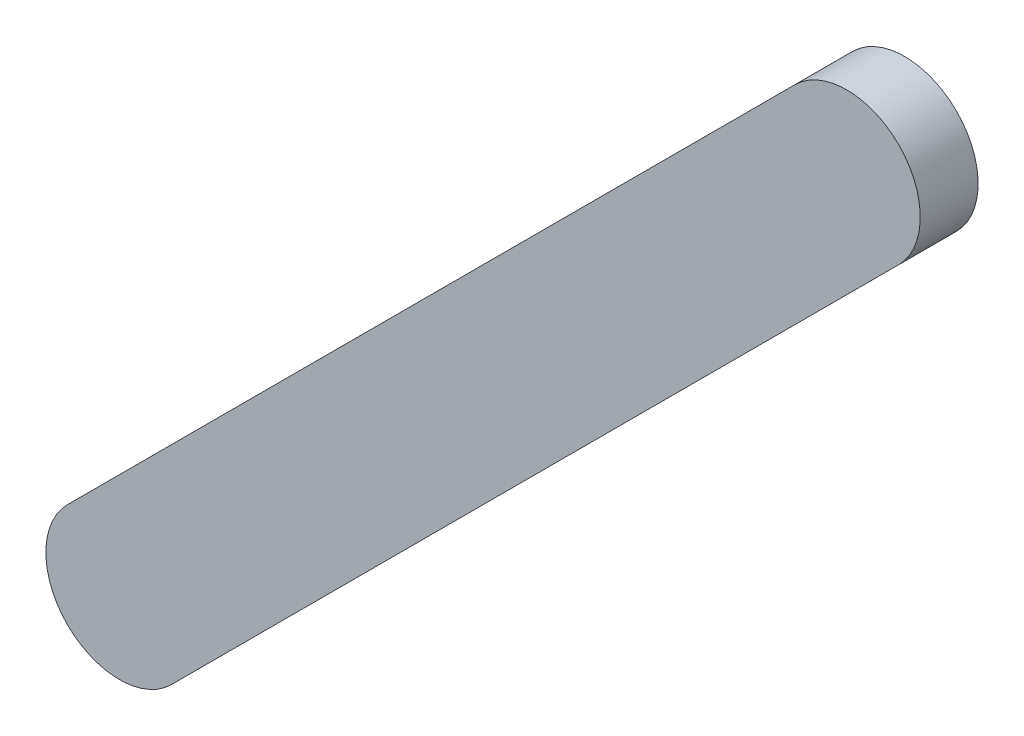
ISO-10303-21;
HEADER;
FILE_DESCRIPTION(('STEP AP214'),'2;1');
FILE_NAME('part.step','',(''),(''),'','','');
FILE_SCHEMA(('AUTOMOTIVE_DESIGN { 1 0 10303 214 1 1 1 1 }'));
ENDSEC;
DATA;
#1=APPLICATION_CONTEXT('core data for automotive mechanical design processes');
#2=APPLICATION_PROTOCOL_DEFINITION('international standard','automotive_design',2000,#1);
#3=PRODUCT_CONTEXT('',#1,'mechanical');
#4=PRODUCT('Part','Part','',(#3));
#5=PRODUCT_RELATED_PRODUCT_CATEGORY('part','',(#4));
#6=PRODUCT_DEFINITION_FORMATION('','',#4);
#7=PRODUCT_DEFINITION_CONTEXT('part definition',#1,'design');
#8=PRODUCT_DEFINITION('design','',#6,#7);
#9=PRODUCT_DEFINITION_SHAPE('','',#8);
#10=(LENGTH_UNIT() NAMED_UNIT(*) SI_UNIT(.MILLI.,.METRE.));
#11=(NAMED_UNIT(*) PLANE_ANGLE_UNIT() SI_UNIT($,.RADIAN.));
#12=(NAMED_UNIT(*) SI_UNIT($,.STERADIAN.) SOLID_ANGLE_UNIT());
#13=UNCERTAINTY_MEASURE_WITH_UNIT(LENGTH_MEASURE(1.E-05),#10,'distance_accuracy_value','');
#14=(GEOMETRIC_REPRESENTATION_CONTEXT(3) GLOBAL_UNCERTAINTY_ASSIGNED_CONTEXT((#13)) GLOBAL_UNIT_ASSIGNED_CONTEXT((#10,
#11,#12)) REPRESENTATION_CONTEXT('',''));
#15=CARTESIAN_POINT('',(0.,0.,0.));
#16=DIRECTION('',(0.,0.,1.));
#17=DIRECTION('',(1.,0.,0.));
#18=AXIS2_PLACEMENT_3D('',#15,#16,#17);
#19=CARTESIAN_POINT('',(113.2096034,68.90839406,0.));
#20=DIRECTION('',(-0.70710678118655,0.707106781186546,0.));
#21=DIRECTION('',(0.707106781186546,0.70710678118655,0.));
#22=AXIS2_PLACEMENT_3D('',#19,#20,#21);
#23=PLANE('',#22);
#24=DIRECTION('',(0.707106781186545,0.70710678118655,0.));
#25=VECTOR('',#24,1.);
#26=CARTESIAN_POINT('',(113.2096034,68.90839406,0.1999996));
#27=LINE('',#26,#25);
#28=CARTESIAN_POINT('',(113.2096034,68.90839406,0.1999996));
#29=VERTEX_POINT('',#28);
#30=CARTESIAN_POINT('',(115.72420594,71.4229966,0.1999996));
#31=VERTEX_POINT('',#30);
#32=EDGE_CURVE('E11',#29,#31,#27,.T.);
#33=ORIENTED_EDGE('',*,*,#32,.F.);
#34=DIRECTION('',(0.,0.,1.));
#35=VECTOR('',#34,1.);
#36=CARTESIAN_POINT('',(113.2096034,68.90839406,0.));
#37=LINE('',#36,#35);
#38=CARTESIAN_POINT('',(113.2096034,68.90839406,0.));
#39=VERTEX_POINT('',#38);
#40=EDGE_CURVE('E24',#39,#29,#37,.T.);
#41=ORIENTED_EDGE('',*,*,#40,.F.);
#42=DIRECTION('',(0.707106781186545,0.70710678118655,0.));
#43=VECTOR('',#42,1.);
#44=CARTESIAN_POINT('',(113.2096034,68.90839406,0.));
#45=LINE('',#44,#43);
#46=CARTESIAN_POINT('',(115.72420594,71.4229966,0.));
#47=VERTEX_POINT('',#46);
#48=EDGE_CURVE('E75',#39,#47,#45,.T.);
#49=ORIENTED_EDGE('',*,*,#48,.T.);
#50=DIRECTION('',(0.,0.,1.));
#51=VECTOR('',#50,1.);
#52=CARTESIAN_POINT('',(115.72420594,71.4229966,0.));
#53=LINE('',#52,#51);
#54=EDGE_CURVE('E37',#47,#31,#53,.T.);
#55=ORIENTED_EDGE('',*,*,#54,.T.);
#56=EDGE_LOOP('',(#33,#41,#49,#55));
#57=FACE_BOUND('',#56,.T.);
#58=ADVANCED_FACE('F17',(#57),#23,.F.);
#59=CARTESIAN_POINT('',(115.54460127,71.60260127,0.));
#60=DIRECTION('',(0.,0.,-1.));
#61=DIRECTION('',(0.707106781186548,-0.707106781186548,0.));
#62=AXIS2_PLACEMENT_3D('',#59,#60,#61);
#63=CYLINDRICAL_SURFACE('',#62,0.253999360179539);
#64=CARTESIAN_POINT('',(115.54460127,71.60260127,0.1999996));
#65=DIRECTION('',(0.,0.,1.));
#66=DIRECTION('',(0.707106781186548,-0.707106781186548,0.));
#67=AXIS2_PLACEMENT_3D('',#64,#65,#66);
#68=CIRCLE('',#67,0.253999360179539);
#69=CARTESIAN_POINT('',(115.3649966,71.78220594,0.1999996));
#70=VERTEX_POINT('',#69);
#71=EDGE_CURVE('E83',#31,#70,#68,.T.);
#72=ORIENTED_EDGE('',*,*,#71,.F.);
#73=ORIENTED_EDGE('',*,*,#54,.F.);
#74=CARTESIAN_POINT('',(115.54460127,71.60260127,0.));
#75=DIRECTION('',(0.,0.,1.));
#76=DIRECTION('',(0.707106781186548,-0.707106781186548,0.));
#77=AXIS2_PLACEMENT_3D('',#74,#75,#76);
#78=CIRCLE('',#77,0.253999360179539);
#79=CARTESIAN_POINT('',(115.3649966,71.78220594,0.));
#80=VERTEX_POINT('',#79);
#81=EDGE_CURVE('E81',#47,#80,#78,.T.);
#82=ORIENTED_EDGE('',*,*,#81,.T.);
#83=DIRECTION('',(0.,0.,1.));
#84=VECTOR('',#83,1.);
#85=CARTESIAN_POINT('',(115.3649966,71.78220594,0.));
#86=LINE('',#85,#84);
#87=EDGE_CURVE('E67',#80,#70,#86,.T.);
#88=ORIENTED_EDGE('',*,*,#87,.T.);
#89=EDGE_LOOP('',(#72,#73,#82,#88));
#90=FACE_BOUND('',#89,.T.);
#91=ADVANCED_FACE('F89',(#90),#63,.T.);
#92=CARTESIAN_POINT('',(115.3649966,71.78220594,0.));
#93=DIRECTION('',(0.707106781186546,-0.70710678118655,0.));
#94=DIRECTION('',(-0.70710678118655,-0.707106781186546,0.));
#95=AXIS2_PLACEMENT_3D('',#92,#93,#94);
#96=PLANE('',#95);
#97=DIRECTION('',(-0.70710678118655,-0.707106781186545,0.));
#98=VECTOR('',#97,1.);
#99=CARTESIAN_POINT('',(115.3649966,71.78220594,0.1999996));
#100=LINE('',#99,#98);
#101=CARTESIAN_POINT('',(112.85039406,69.2676034,0.1999996));
#102=VERTEX_POINT('',#101);
#103=EDGE_CURVE('E71',#70,#102,#100,.T.);
#104=ORIENTED_EDGE('',*,*,#103,.F.);
#105=ORIENTED_EDGE('',*,*,#87,.F.);
#106=DIRECTION('',(-0.70710678118655,-0.707106781186545,0.));
#107=VECTOR('',#106,1.);
#108=CARTESIAN_POINT('',(115.3649966,71.78220594,0.));
#109=LINE('',#108,#107);
#110=CARTESIAN_POINT('',(112.85039406,69.2676034,0.));
#111=VERTEX_POINT('',#110);
#112=EDGE_CURVE('E63',#80,#111,#109,.T.);
#113=ORIENTED_EDGE('',*,*,#112,.T.);
#114=DIRECTION('',(0.,0.,1.));
#115=VECTOR('',#114,1.);
#116=CARTESIAN_POINT('',(112.85039406,69.2676034,0.));
#117=LINE('',#116,#115);
#118=EDGE_CURVE('E53',#111,#102,#117,.T.);
#119=ORIENTED_EDGE('',*,*,#118,.T.);
#120=EDGE_LOOP('',(#104,#105,#113,#119));
#121=FACE_BOUND('',#120,.T.);
#122=ADVANCED_FACE('F66',(#121),#96,.F.);
#123=CARTESIAN_POINT('',(113.02999873,69.08799873,0.));
#124=DIRECTION('',(0.,0.,-1.));
#125=DIRECTION('',(-0.707106781186548,0.707106781186548,0.));
#126=AXIS2_PLACEMENT_3D('',#123,#124,#125);
#127=CYLINDRICAL_SURFACE('',#126,0.253999360179549);
#128=CARTESIAN_POINT('',(113.02999873,69.08799873,0.1999996));
#129=DIRECTION('',(0.,0.,1.));
#130=DIRECTION('',(-0.707106781186548,0.707106781186548,0.));
#131=AXIS2_PLACEMENT_3D('',#128,#129,#130);
#132=CIRCLE('',#131,0.253999360179549);
#133=EDGE_CURVE('E59',#102,#29,#132,.T.);
#134=ORIENTED_EDGE('',*,*,#133,.F.);
#135=ORIENTED_EDGE('',*,*,#118,.F.);
#136=CARTESIAN_POINT('',(113.02999873,69.08799873,0.));
#137=DIRECTION('',(0.,0.,1.));
#138=DIRECTION('',(-0.707106781186548,0.707106781186548,0.));
#139=AXIS2_PLACEMENT_3D('',#136,#137,#138);
#140=CIRCLE('',#139,0.253999360179549);
#141=EDGE_CURVE('E57',#111,#39,#140,.T.);
#142=ORIENTED_EDGE('',*,*,#141,.T.);
#143=ORIENTED_EDGE('',*,*,#40,.T.);
#144=EDGE_LOOP('',(#134,#135,#142,#143));
#145=FACE_BOUND('',#144,.T.);
#146=ADVANCED_FACE('F55',(#145),#127,.T.);
#147=CARTESIAN_POINT('',(113.2096034,68.90839406,0.));
#148=DIRECTION('',(0.,0.,-1.));
#149=DIRECTION('',(-1.,0.,0.));
#150=AXIS2_PLACEMENT_3D('',#147,#148,#149);
#151=PLANE('',#150);
#152=ORIENTED_EDGE('',*,*,#141,.F.);
#153=ORIENTED_EDGE('',*,*,#112,.F.);
#154=ORIENTED_EDGE('',*,*,#81,.F.);
#155=ORIENTED_EDGE('',*,*,#48,.F.);
#156=EDGE_LOOP('',(#152,#153,#154,#155));
#157=FACE_BOUND('',#156,.T.);
#158=ADVANCED_FACE('F74',(#157),#151,.T.);
#159=CARTESIAN_POINT('',(113.2096034,68.90839406,0.1999996));
#160=DIRECTION('',(0.,0.,-1.));
#161=DIRECTION('',(-1.,0.,0.));
#162=AXIS2_PLACEMENT_3D('',#159,#160,#161);
#163=PLANE('',#162);
#164=ORIENTED_EDGE('',*,*,#32,.T.);
#165=ORIENTED_EDGE('',*,*,#71,.T.);
#166=ORIENTED_EDGE('',*,*,#103,.T.);
#167=ORIENTED_EDGE('',*,*,#133,.T.);
#168=EDGE_LOOP('',(#164,#165,#166,#167));
#169=FACE_BOUND('',#168,.T.);
#170=ADVANCED_FACE('F91',(#169),#163,.F.);
#171=CLOSED_SHELL('',(#58,#91,#122,#146,#158,#170));
#172=MANIFOLD_SOLID_BREP('B1',#171);
#173=ADVANCED_BREP_SHAPE_REPRESENTATION('',(#18,#172),#14);
#174=SHAPE_DEFINITION_REPRESENTATION(#9,#173);
ENDSEC;
END-ISO-10303-21;
